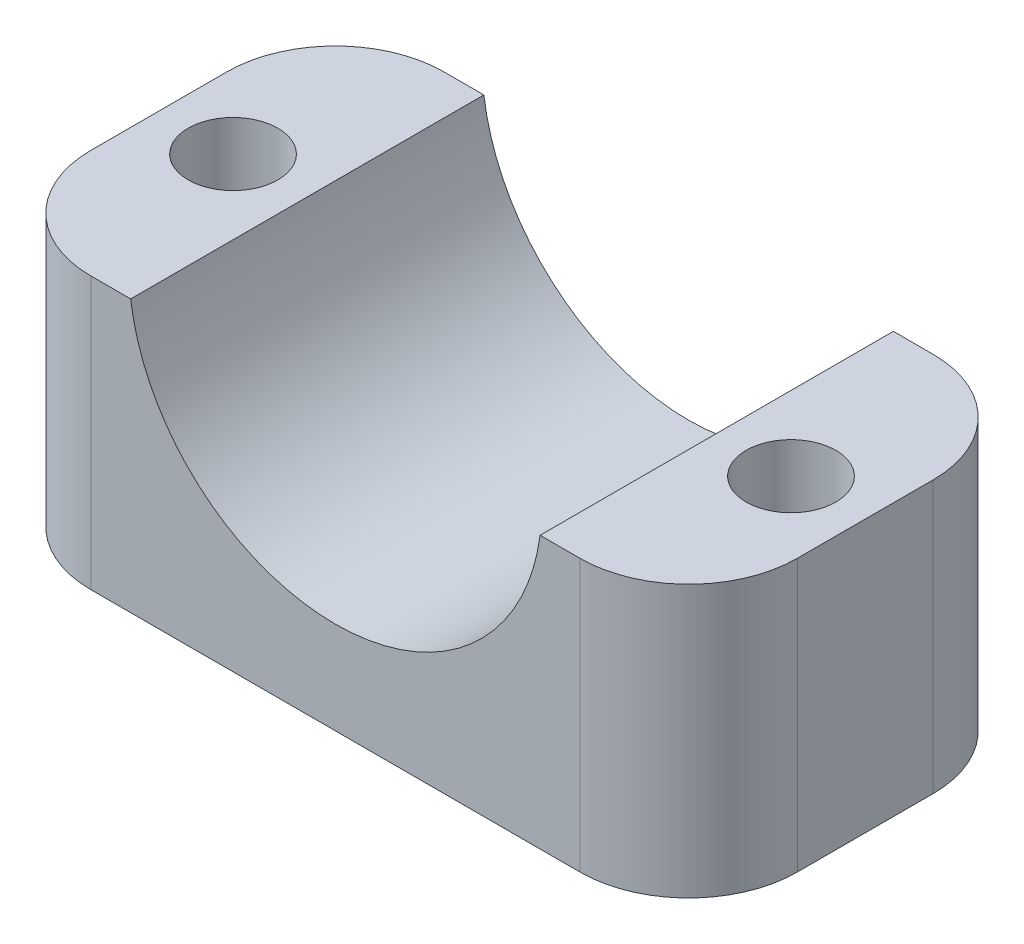
ISO-10303-21;
HEADER;
FILE_DESCRIPTION(('STEP AP214'),'2;1');
FILE_NAME('part.step','',(''),(''),'','','');
FILE_SCHEMA(('AUTOMOTIVE_DESIGN { 1 0 10303 214 1 1 1 1 }'));
ENDSEC;
DATA;
#1=APPLICATION_CONTEXT('core data for automotive mechanical design processes');
#2=APPLICATION_PROTOCOL_DEFINITION('international standard','automotive_design',2000,#1);
#3=PRODUCT_CONTEXT('',#1,'mechanical');
#4=PRODUCT('Part','Part','',(#3));
#5=PRODUCT_RELATED_PRODUCT_CATEGORY('part','',(#4));
#6=PRODUCT_DEFINITION_FORMATION('','',#4);
#7=PRODUCT_DEFINITION_CONTEXT('part definition',#1,'design');
#8=PRODUCT_DEFINITION('design','',#6,#7);
#9=PRODUCT_DEFINITION_SHAPE('','',#8);
#10=(LENGTH_UNIT() NAMED_UNIT(*) SI_UNIT(.MILLI.,.METRE.));
#11=(NAMED_UNIT(*) PLANE_ANGLE_UNIT() SI_UNIT($,.RADIAN.));
#12=(NAMED_UNIT(*) SI_UNIT($,.STERADIAN.) SOLID_ANGLE_UNIT());
#13=UNCERTAINTY_MEASURE_WITH_UNIT(LENGTH_MEASURE(1.E-05),#10,'distance_accuracy_value','');
#14=(GEOMETRIC_REPRESENTATION_CONTEXT(3) GLOBAL_UNCERTAINTY_ASSIGNED_CONTEXT((#13)) GLOBAL_UNIT_ASSIGNED_CONTEXT((#10,
#11,#12)) REPRESENTATION_CONTEXT('',''));
#15=CARTESIAN_POINT('',(0.,0.,0.));
#16=DIRECTION('',(0.,0.,1.));
#17=DIRECTION('',(1.,0.,0.));
#18=AXIS2_PLACEMENT_3D('',#15,#16,#17);
#19=CARTESIAN_POINT('',(-13.,5.,13.));
#20=DIRECTION('',(0.,-1.,0.));
#21=DIRECTION('',(0.,0.,-1.));
#22=AXIS2_PLACEMENT_3D('',#19,#20,#21);
#23=PLANE('',#22);
#24=CARTESIAN_POINT('',(10.2669616403675,5.,6.5));
#25=DIRECTION('',(0.,1.,0.));
#26=DIRECTION('',(0.,0.,1.));
#27=AXIS2_PLACEMENT_3D('',#24,#25,#26);
#28=CIRCLE('',#27,1.65);
#29=CARTESIAN_POINT('',(10.2669616403675,5.,8.15));
#30=VERTEX_POINT('',#29);
#31=EDGE_CURVE('E206',#30,#30,#28,.T.);
#32=ORIENTED_EDGE('',*,*,#31,.F.);
#33=EDGE_LOOP('',(#32));
#34=FACE_BOUND('',#33,.T.);
#35=DIRECTION('',(-1.,0.,0.));
#36=VECTOR('',#35,1.);
#37=CARTESIAN_POINT('',(-13.,5.,13.));
#38=LINE('',#37,#36);
#39=CARTESIAN_POINT('',(8.99999999999999,5.,13.));
#40=VERTEX_POINT('',#39);
#41=CARTESIAN_POINT('',(7.53392328073494,5.,13.));
#42=VERTEX_POINT('',#41);
#43=EDGE_CURVE('E202',#40,#42,#38,.T.);
#44=ORIENTED_EDGE('',*,*,#43,.F.);
#45=CARTESIAN_POINT('',(9.,5.,9.));
#46=DIRECTION('',(0.,-1.,0.));
#47=DIRECTION('',(0.,0.,-1.));
#48=AXIS2_PLACEMENT_3D('',#45,#46,#47);
#49=CIRCLE('',#48,4.);
#50=CARTESIAN_POINT('',(13.,5.,9.));
#51=VERTEX_POINT('',#50);
#52=EDGE_CURVE('E166',#40,#51,#49,.F.);
#53=ORIENTED_EDGE('',*,*,#52,.T.);
#54=DIRECTION('',(0.,0.,-1.));
#55=VECTOR('',#54,1.);
#56=CARTESIAN_POINT('',(13.,5.,13.));
#57=LINE('',#56,#55);
#58=CARTESIAN_POINT('',(13.,5.,4.));
#59=VERTEX_POINT('',#58);
#60=EDGE_CURVE('E155',#51,#59,#57,.T.);
#61=ORIENTED_EDGE('',*,*,#60,.T.);
#62=CARTESIAN_POINT('',(9.,5.,4.));
#63=DIRECTION('',(0.,-1.,0.));
#64=DIRECTION('',(0.,0.,-1.));
#65=AXIS2_PLACEMENT_3D('',#62,#63,#64);
#66=CIRCLE('',#65,4.);
#67=CARTESIAN_POINT('',(8.99999999999999,5.,0.));
#68=VERTEX_POINT('',#67);
#69=EDGE_CURVE('E164',#59,#68,#66,.F.);
#70=ORIENTED_EDGE('',*,*,#69,.T.);
#71=DIRECTION('',(-1.,0.,0.));
#72=VECTOR('',#71,1.);
#73=CARTESIAN_POINT('',(-13.,5.,0.));
#74=LINE('',#73,#72);
#75=CARTESIAN_POINT('',(7.53392328073494,5.,0.));
#76=VERTEX_POINT('',#75);
#77=EDGE_CURVE('E137',#68,#76,#74,.T.);
#78=ORIENTED_EDGE('',*,*,#77,.T.);
#79=DIRECTION('',(0.,0.,1.));
#80=VECTOR('',#79,1.);
#81=CARTESIAN_POINT('',(7.53392328073494,5.,0.));
#82=LINE('',#81,#80);
#83=EDGE_CURVE('E121',#76,#42,#82,.T.);
#84=ORIENTED_EDGE('',*,*,#83,.T.);
#85=EDGE_LOOP('',(#44,#53,#61,#70,#78,#84));
#86=FACE_BOUND('',#85,.T.);
#87=ADVANCED_FACE('F37',(#34,#86),#23,.F.);
#88=CARTESIAN_POINT('',(13.,-5.,13.));
#89=DIRECTION('',(-1.,0.,0.));
#90=DIRECTION('',(0.,0.,1.));
#91=AXIS2_PLACEMENT_3D('',#88,#89,#90);
#92=PLANE('',#91);
#93=ORIENTED_EDGE('',*,*,#60,.F.);
#94=DIRECTION('',(0.,1.,0.));
#95=VECTOR('',#94,1.);
#96=CARTESIAN_POINT('',(13.,-5.,9.));
#97=LINE('',#96,#95);
#98=CARTESIAN_POINT('',(13.,-5.,9.));
#99=VERTEX_POINT('',#98);
#100=EDGE_CURVE('E171',#51,#99,#97,.F.);
#101=ORIENTED_EDGE('',*,*,#100,.T.);
#102=DIRECTION('',(0.,0.,-1.));
#103=VECTOR('',#102,1.);
#104=CARTESIAN_POINT('',(13.,-5.,13.));
#105=LINE('',#104,#103);
#106=CARTESIAN_POINT('',(13.,-5.,4.));
#107=VERTEX_POINT('',#106);
#108=EDGE_CURVE('E147',#99,#107,#105,.T.);
#109=ORIENTED_EDGE('',*,*,#108,.T.);
#110=DIRECTION('',(0.,1.,0.));
#111=VECTOR('',#110,1.);
#112=CARTESIAN_POINT('',(13.,5.,4.));
#113=LINE('',#112,#111);
#114=EDGE_CURVE('E168',#107,#59,#113,.T.);
#115=ORIENTED_EDGE('',*,*,#114,.T.);
#116=EDGE_LOOP('',(#93,#101,#109,#115));
#117=FACE_BOUND('',#116,.T.);
#118=ADVANCED_FACE('F229',(#117),#92,.F.);
#119=CARTESIAN_POINT('',(-10.2669616403675,5.,6.5));
#120=DIRECTION('',(0.,1.,0.));
#121=DIRECTION('',(0.,0.,1.));
#122=AXIS2_PLACEMENT_3D('',#119,#120,#121);
#123=CIRCLE('',#122,1.65);
#124=CARTESIAN_POINT('',(-10.2669616403675,5.,8.15));
#125=VERTEX_POINT('',#124);
#126=EDGE_CURVE('E212',#125,#125,#123,.T.);
#127=ORIENTED_EDGE('',*,*,#126,.F.);
#128=EDGE_LOOP('',(#127));
#129=FACE_BOUND('',#128,.T.);
#130=DIRECTION('',(0.,0.,-1.));
#131=VECTOR('',#130,1.);
#132=CARTESIAN_POINT('',(-13.,5.,13.));
#133=LINE('',#132,#131);
#134=CARTESIAN_POINT('',(-13.,5.,9.));
#135=VERTEX_POINT('',#134);
#136=CARTESIAN_POINT('',(-13.,5.,4.));
#137=VERTEX_POINT('',#136);
#138=EDGE_CURVE('E153',#135,#137,#133,.T.);
#139=ORIENTED_EDGE('',*,*,#138,.F.);
#140=CARTESIAN_POINT('',(-9.,5.,9.));
#141=DIRECTION('',(0.,-1.,0.));
#142=DIRECTION('',(0.,0.,-1.));
#143=AXIS2_PLACEMENT_3D('',#140,#141,#142);
#144=CIRCLE('',#143,4.);
#145=CARTESIAN_POINT('',(-9.,5.,13.));
#146=VERTEX_POINT('',#145);
#147=EDGE_CURVE('E11',#135,#146,#144,.F.);
#148=ORIENTED_EDGE('',*,*,#147,.T.);
#149=CARTESIAN_POINT('',(-7.53392328073494,5.,13.));
#150=VERTEX_POINT('',#149);
#151=EDGE_CURVE('E131',#150,#146,#38,.T.);
#152=ORIENTED_EDGE('',*,*,#151,.F.);
#153=DIRECTION('',(0.,0.,1.));
#154=VECTOR('',#153,1.);
#155=CARTESIAN_POINT('',(-7.53392328073494,5.,0.));
#156=LINE('',#155,#154);
#157=CARTESIAN_POINT('',(-7.53392328073494,5.,0.));
#158=VERTEX_POINT('',#157);
#159=EDGE_CURVE('E118',#150,#158,#156,.F.);
#160=ORIENTED_EDGE('',*,*,#159,.T.);
#161=CARTESIAN_POINT('',(-9.,5.,0.));
#162=VERTEX_POINT('',#161);
#163=EDGE_CURVE('E129',#158,#162,#74,.T.);
#164=ORIENTED_EDGE('',*,*,#163,.T.);
#165=CARTESIAN_POINT('',(-9.,5.,4.));
#166=DIRECTION('',(0.,-1.,0.));
#167=DIRECTION('',(0.,0.,-1.));
#168=AXIS2_PLACEMENT_3D('',#165,#166,#167);
#169=CIRCLE('',#168,4.);
#170=EDGE_CURVE('E45',#162,#137,#169,.F.);
#171=ORIENTED_EDGE('',*,*,#170,.T.);
#172=EDGE_LOOP('',(#139,#148,#152,#160,#164,#171));
#173=FACE_BOUND('',#172,.T.);
#174=ADVANCED_FACE('F128',(#129,#173),#23,.F.);
#175=CARTESIAN_POINT('',(-13.,-5.,13.));
#176=DIRECTION('',(1.,0.,0.));
#177=DIRECTION('',(0.,0.,-1.));
#178=AXIS2_PLACEMENT_3D('',#175,#176,#177);
#179=PLANE('',#178);
#180=DIRECTION('',(0.,0.,-1.));
#181=VECTOR('',#180,1.);
#182=CARTESIAN_POINT('',(-13.,-5.,13.));
#183=LINE('',#182,#181);
#184=CARTESIAN_POINT('',(-13.,-5.,9.));
#185=VERTEX_POINT('',#184);
#186=CARTESIAN_POINT('',(-13.,-5.,4.));
#187=VERTEX_POINT('',#186);
#188=EDGE_CURVE('E150',#185,#187,#183,.T.);
#189=ORIENTED_EDGE('',*,*,#188,.F.);
#190=DIRECTION('',(0.,-1.,0.));
#191=VECTOR('',#190,1.);
#192=CARTESIAN_POINT('',(-13.,-5.,9.));
#193=LINE('',#192,#191);
#194=EDGE_CURVE('E58',#185,#135,#193,.F.);
#195=ORIENTED_EDGE('',*,*,#194,.T.);
#196=ORIENTED_EDGE('',*,*,#138,.T.);
#197=DIRECTION('',(0.,-1.,0.));
#198=VECTOR('',#197,1.);
#199=CARTESIAN_POINT('',(-13.,-5.,4.));
#200=LINE('',#199,#198);
#201=EDGE_CURVE('E184',#137,#187,#200,.T.);
#202=ORIENTED_EDGE('',*,*,#201,.T.);
#203=EDGE_LOOP('',(#189,#195,#196,#202));
#204=FACE_BOUND('',#203,.T.);
#205=ADVANCED_FACE('F188',(#204),#179,.F.);
#206=CARTESIAN_POINT('',(-13.,-5.,13.));
#207=DIRECTION('',(0.,1.,0.));
#208=DIRECTION('',(0.,0.,1.));
#209=AXIS2_PLACEMENT_3D('',#206,#207,#208);
#210=PLANE('',#209);
#211=CARTESIAN_POINT('',(-10.2669616403675,-5.,6.5));
#212=DIRECTION('',(0.,1.,0.));
#213=DIRECTION('',(0.,0.,1.));
#214=AXIS2_PLACEMENT_3D('',#211,#212,#213);
#215=CIRCLE('',#214,1.65);
#216=CARTESIAN_POINT('',(-10.2669616403675,-5.,8.15));
#217=VERTEX_POINT('',#216);
#218=EDGE_CURVE('E204',#217,#217,#215,.T.);
#219=ORIENTED_EDGE('',*,*,#218,.T.);
#220=EDGE_LOOP('',(#219));
#221=FACE_BOUND('',#220,.T.);
#222=CARTESIAN_POINT('',(10.2669616403675,-5.,6.5));
#223=DIRECTION('',(0.,1.,0.));
#224=DIRECTION('',(0.,0.,1.));
#225=AXIS2_PLACEMENT_3D('',#222,#223,#224);
#226=CIRCLE('',#225,1.65);
#227=CARTESIAN_POINT('',(10.2669616403675,-5.,8.15));
#228=VERTEX_POINT('',#227);
#229=EDGE_CURVE('E209',#228,#228,#226,.T.);
#230=ORIENTED_EDGE('',*,*,#229,.T.);
#231=EDGE_LOOP('',(#230));
#232=FACE_BOUND('',#231,.T.);
#233=ORIENTED_EDGE('',*,*,#108,.F.);
#234=CARTESIAN_POINT('',(9.,-5.,9.));
#235=DIRECTION('',(0.,1.,0.));
#236=DIRECTION('',(0.,0.,1.));
#237=AXIS2_PLACEMENT_3D('',#234,#235,#236);
#238=CIRCLE('',#237,4.);
#239=CARTESIAN_POINT('',(8.99999999999999,-5.,13.));
#240=VERTEX_POINT('',#239);
#241=EDGE_CURVE('E179',#99,#240,#238,.F.);
#242=ORIENTED_EDGE('',*,*,#241,.T.);
#243=DIRECTION('',(1.,0.,0.));
#244=VECTOR('',#243,1.);
#245=CARTESIAN_POINT('',(-13.,-5.,13.));
#246=LINE('',#245,#244);
#247=CARTESIAN_POINT('',(-9.,-5.,13.));
#248=VERTEX_POINT('',#247);
#249=EDGE_CURVE('E143',#248,#240,#246,.T.);
#250=ORIENTED_EDGE('',*,*,#249,.F.);
#251=CARTESIAN_POINT('',(-9.,-5.,9.));
#252=DIRECTION('',(0.,1.,0.));
#253=DIRECTION('',(0.,0.,1.));
#254=AXIS2_PLACEMENT_3D('',#251,#252,#253);
#255=CIRCLE('',#254,4.);
#256=EDGE_CURVE('E175',#248,#185,#255,.F.);
#257=ORIENTED_EDGE('',*,*,#256,.T.);
#258=ORIENTED_EDGE('',*,*,#188,.T.);
#259=CARTESIAN_POINT('',(-9.,-5.,4.));
#260=DIRECTION('',(0.,1.,0.));
#261=DIRECTION('',(0.,0.,1.));
#262=AXIS2_PLACEMENT_3D('',#259,#260,#261);
#263=CIRCLE('',#262,4.);
#264=CARTESIAN_POINT('',(-9.,-5.,0.));
#265=VERTEX_POINT('',#264);
#266=EDGE_CURVE('E173',#187,#265,#263,.F.);
#267=ORIENTED_EDGE('',*,*,#266,.T.);
#268=DIRECTION('',(1.,0.,0.));
#269=VECTOR('',#268,1.);
#270=CARTESIAN_POINT('',(-13.,-5.,0.));
#271=LINE('',#270,#269);
#272=CARTESIAN_POINT('',(8.99999999999999,-5.,0.));
#273=VERTEX_POINT('',#272);
#274=EDGE_CURVE('E139',#265,#273,#271,.T.);
#275=ORIENTED_EDGE('',*,*,#274,.T.);
#276=CARTESIAN_POINT('',(9.,-5.,4.));
#277=DIRECTION('',(0.,1.,0.));
#278=DIRECTION('',(0.,0.,1.));
#279=AXIS2_PLACEMENT_3D('',#276,#277,#278);
#280=CIRCLE('',#279,4.);
#281=EDGE_CURVE('E177',#273,#107,#280,.F.);
#282=ORIENTED_EDGE('',*,*,#281,.T.);
#283=EDGE_LOOP('',(#233,#242,#250,#257,#258,#267,#275,#282));
#284=FACE_BOUND('',#283,.T.);
#285=ADVANCED_FACE('F192',(#221,#232,#284),#210,.F.);
#286=CARTESIAN_POINT('',(0.,0.,13.));
#287=DIRECTION('',(0.,0.,-1.));
#288=DIRECTION('',(-1.,0.,0.));
#289=AXIS2_PLACEMENT_3D('',#286,#287,#288);
#290=PLANE('',#289);
#291=ORIENTED_EDGE('',*,*,#249,.T.);
#292=DIRECTION('',(0.,1.,0.));
#293=VECTOR('',#292,1.);
#294=CARTESIAN_POINT('',(9.,0.,13.));
#295=LINE('',#294,#293);
#296=EDGE_CURVE('E161',#240,#40,#295,.T.);
#297=ORIENTED_EDGE('',*,*,#296,.T.);
#298=ORIENTED_EDGE('',*,*,#43,.T.);
#299=CARTESIAN_POINT('',(0.,6.,13.));
#300=DIRECTION('',(0.,0.,1.));
#301=DIRECTION('',(1.,0.,0.));
#302=AXIS2_PLACEMENT_3D('',#299,#300,#301);
#303=CIRCLE('',#302,7.6);
#304=EDGE_CURVE('E125',#150,#42,#303,.T.);
#305=ORIENTED_EDGE('',*,*,#304,.F.);
#306=ORIENTED_EDGE('',*,*,#151,.T.);
#307=DIRECTION('',(0.,-1.,0.));
#308=VECTOR('',#307,1.);
#309=CARTESIAN_POINT('',(-9.,0.,13.));
#310=LINE('',#309,#308);
#311=EDGE_CURVE('E158',#146,#248,#310,.T.);
#312=ORIENTED_EDGE('',*,*,#311,.T.);
#313=EDGE_LOOP('',(#291,#297,#298,#305,#306,#312));
#314=FACE_BOUND('',#313,.T.);
#315=ADVANCED_FACE('F200',(#314),#290,.F.);
#316=CARTESIAN_POINT('',(0.,0.,0.));
#317=DIRECTION('',(0.,0.,-1.));
#318=DIRECTION('',(-1.,0.,0.));
#319=AXIS2_PLACEMENT_3D('',#316,#317,#318);
#320=PLANE('',#319);
#321=ORIENTED_EDGE('',*,*,#77,.F.);
#322=DIRECTION('',(0.,1.,0.));
#323=VECTOR('',#322,1.);
#324=CARTESIAN_POINT('',(9.,-5.,0.));
#325=LINE('',#324,#323);
#326=EDGE_CURVE('E182',#68,#273,#325,.F.);
#327=ORIENTED_EDGE('',*,*,#326,.T.);
#328=ORIENTED_EDGE('',*,*,#274,.F.);
#329=DIRECTION('',(0.,-1.,0.));
#330=VECTOR('',#329,1.);
#331=CARTESIAN_POINT('',(-9.,5.,0.));
#332=LINE('',#331,#330);
#333=EDGE_CURVE('E136',#265,#162,#332,.F.);
#334=ORIENTED_EDGE('',*,*,#333,.T.);
#335=ORIENTED_EDGE('',*,*,#163,.F.);
#336=CARTESIAN_POINT('',(0.,6.,0.));
#337=DIRECTION('',(0.,0.,1.));
#338=DIRECTION('',(1.,0.,0.));
#339=AXIS2_PLACEMENT_3D('',#336,#337,#338);
#340=CIRCLE('',#339,7.6);
#341=EDGE_CURVE('E114',#158,#76,#340,.T.);
#342=ORIENTED_EDGE('',*,*,#341,.T.);
#343=EDGE_LOOP('',(#321,#327,#328,#334,#335,#342));
#344=FACE_BOUND('',#343,.T.);
#345=ADVANCED_FACE('F133',(#344),#320,.T.);
#346=CARTESIAN_POINT('',(0.,6.,0.));
#347=DIRECTION('',(0.,0.,1.));
#348=DIRECTION('',(1.,0.,0.));
#349=AXIS2_PLACEMENT_3D('',#346,#347,#348);
#350=CYLINDRICAL_SURFACE('',#349,7.6);
#351=ORIENTED_EDGE('',*,*,#341,.F.);
#352=ORIENTED_EDGE('',*,*,#159,.F.);
#353=ORIENTED_EDGE('',*,*,#304,.T.);
#354=ORIENTED_EDGE('',*,*,#83,.F.);
#355=EDGE_LOOP('',(#351,#352,#353,#354));
#356=FACE_BOUND('',#355,.T.);
#357=ADVANCED_FACE('F116',(#356),#350,.F.);
#358=CARTESIAN_POINT('',(10.2669616403675,-5.,6.5));
#359=DIRECTION('',(0.,1.,0.));
#360=DIRECTION('',(0.,0.,1.));
#361=AXIS2_PLACEMENT_3D('',#358,#359,#360);
#362=CYLINDRICAL_SURFACE('',#361,1.65);
#363=ORIENTED_EDGE('',*,*,#229,.F.);
#364=EDGE_LOOP('',(#363));
#365=FACE_BOUND('',#364,.T.);
#366=ORIENTED_EDGE('',*,*,#31,.T.);
#367=EDGE_LOOP('',(#366));
#368=FACE_BOUND('',#367,.T.);
#369=ADVANCED_FACE('F224',(#365,#368),#362,.F.);
#370=CARTESIAN_POINT('',(-10.2669616403675,-5.,6.5));
#371=DIRECTION('',(0.,1.,0.));
#372=DIRECTION('',(0.,0.,1.));
#373=AXIS2_PLACEMENT_3D('',#370,#371,#372);
#374=CYLINDRICAL_SURFACE('',#373,1.65);
#375=ORIENTED_EDGE('',*,*,#218,.F.);
#376=EDGE_LOOP('',(#375));
#377=FACE_BOUND('',#376,.T.);
#378=ORIENTED_EDGE('',*,*,#126,.T.);
#379=EDGE_LOOP('',(#378));
#380=FACE_BOUND('',#379,.T.);
#381=ADVANCED_FACE('F220',(#377,#380),#374,.F.);
#382=CARTESIAN_POINT('',(9.,0.,9.));
#383=DIRECTION('',(0.,1.,0.));
#384=DIRECTION('',(0.,0.,1.));
#385=AXIS2_PLACEMENT_3D('',#382,#383,#384);
#386=CYLINDRICAL_SURFACE('',#385,4.);
#387=ORIENTED_EDGE('',*,*,#241,.F.);
#388=ORIENTED_EDGE('',*,*,#100,.F.);
#389=ORIENTED_EDGE('',*,*,#52,.F.);
#390=ORIENTED_EDGE('',*,*,#296,.F.);
#391=EDGE_LOOP('',(#387,#388,#389,#390));
#392=FACE_BOUND('',#391,.T.);
#393=ADVANCED_FACE('F223',(#392),#386,.T.);
#394=CARTESIAN_POINT('',(9.,-5.,4.));
#395=DIRECTION('',(0.,-1.,0.));
#396=DIRECTION('',(0.,0.,-1.));
#397=AXIS2_PLACEMENT_3D('',#394,#395,#396);
#398=CYLINDRICAL_SURFACE('',#397,4.);
#399=ORIENTED_EDGE('',*,*,#281,.F.);
#400=ORIENTED_EDGE('',*,*,#326,.F.);
#401=ORIENTED_EDGE('',*,*,#69,.F.);
#402=ORIENTED_EDGE('',*,*,#114,.F.);
#403=EDGE_LOOP('',(#399,#400,#401,#402));
#404=FACE_BOUND('',#403,.T.);
#405=ADVANCED_FACE('F253',(#404),#398,.T.);
#406=CARTESIAN_POINT('',(-9.,0.,9.));
#407=DIRECTION('',(0.,-1.,0.));
#408=DIRECTION('',(0.,0.,-1.));
#409=AXIS2_PLACEMENT_3D('',#406,#407,#408);
#410=CYLINDRICAL_SURFACE('',#409,4.);
#411=ORIENTED_EDGE('',*,*,#147,.F.);
#412=ORIENTED_EDGE('',*,*,#194,.F.);
#413=ORIENTED_EDGE('',*,*,#256,.F.);
#414=ORIENTED_EDGE('',*,*,#311,.F.);
#415=EDGE_LOOP('',(#411,#412,#413,#414));
#416=FACE_BOUND('',#415,.T.);
#417=ADVANCED_FACE('F198',(#416),#410,.T.);
#418=CARTESIAN_POINT('',(-9.,-5.,4.));
#419=DIRECTION('',(0.,1.,0.));
#420=DIRECTION('',(0.,0.,1.));
#421=AXIS2_PLACEMENT_3D('',#418,#419,#420);
#422=CYLINDRICAL_SURFACE('',#421,4.);
#423=ORIENTED_EDGE('',*,*,#170,.F.);
#424=ORIENTED_EDGE('',*,*,#333,.F.);
#425=ORIENTED_EDGE('',*,*,#266,.F.);
#426=ORIENTED_EDGE('',*,*,#201,.F.);
#427=EDGE_LOOP('',(#423,#424,#425,#426));
#428=FACE_BOUND('',#427,.T.);
#429=ADVANCED_FACE('F39',(#428),#422,.T.);
#430=CLOSED_SHELL('',(#87,#118,#174,#205,#285,#315,#345,#357,#369,#381,#393,#405,#417,#429));
#431=MANIFOLD_SOLID_BREP('B2',#430);
#432=ADVANCED_BREP_SHAPE_REPRESENTATION('',(#18,#431),#14);
#433=SHAPE_DEFINITION_REPRESENTATION(#9,#432);
ENDSEC;
END-ISO-10303-21;
